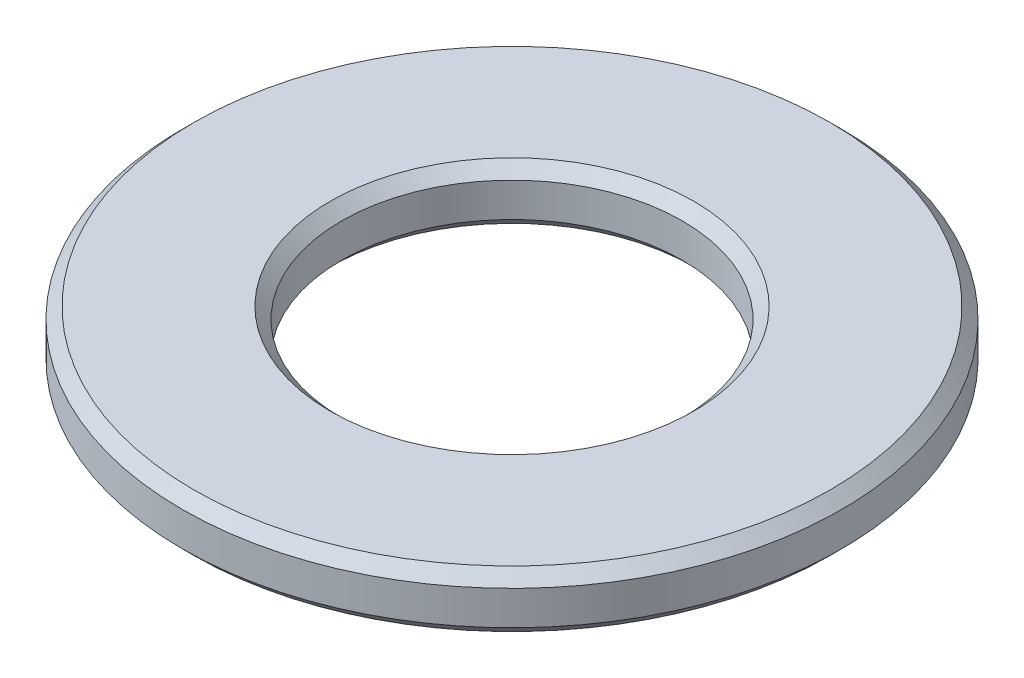
ISO-10303-21;
HEADER;
FILE_DESCRIPTION(('STEP AP214'),'2;1');
FILE_NAME('part.step','',(''),(''),'','','');
FILE_SCHEMA(('AUTOMOTIVE_DESIGN { 1 0 10303 214 1 1 1 1 }'));
ENDSEC;
DATA;
#1=APPLICATION_CONTEXT('core data for automotive mechanical design processes');
#2=APPLICATION_PROTOCOL_DEFINITION('international standard','automotive_design',2000,#1);
#3=PRODUCT_CONTEXT('',#1,'mechanical');
#4=PRODUCT('Part','Part','',(#3));
#5=PRODUCT_RELATED_PRODUCT_CATEGORY('part','',(#4));
#6=PRODUCT_DEFINITION_FORMATION('','',#4);
#7=PRODUCT_DEFINITION_CONTEXT('part definition',#1,'design');
#8=PRODUCT_DEFINITION('design','',#6,#7);
#9=PRODUCT_DEFINITION_SHAPE('','',#8);
#10=(LENGTH_UNIT() NAMED_UNIT(*) SI_UNIT(.MILLI.,.METRE.));
#11=(NAMED_UNIT(*) PLANE_ANGLE_UNIT() SI_UNIT($,.RADIAN.));
#12=(NAMED_UNIT(*) SI_UNIT($,.STERADIAN.) SOLID_ANGLE_UNIT());
#13=UNCERTAINTY_MEASURE_WITH_UNIT(LENGTH_MEASURE(1.E-05),#10,'distance_accuracy_value','');
#14=(GEOMETRIC_REPRESENTATION_CONTEXT(3) GLOBAL_UNCERTAINTY_ASSIGNED_CONTEXT((#13)) GLOBAL_UNIT_ASSIGNED_CONTEXT((#10,
#11,#12)) REPRESENTATION_CONTEXT('',''));
#15=CARTESIAN_POINT('',(0.,0.,0.));
#16=DIRECTION('',(0.,0.,1.));
#17=DIRECTION('',(1.,0.,0.));
#18=AXIS2_PLACEMENT_3D('',#15,#16,#17);
#19=CARTESIAN_POINT('',(0.,0.5,0.));
#20=DIRECTION('',(0.,1.,0.));
#21=DIRECTION('',(0.,0.,1.));
#22=AXIS2_PLACEMENT_3D('',#19,#20,#21);
#23=PLANE('',#22);
#24=CARTESIAN_POINT('',(0.,0.5,0.));
#25=DIRECTION('',(0.,1.,0.));
#26=DIRECTION('',(0.,0.,1.));
#27=AXIS2_PLACEMENT_3D('',#24,#25,#26);
#28=CIRCLE('',#27,1.6);
#29=CARTESIAN_POINT('',(0.,0.5,1.6));
#30=VERTEX_POINT('',#29);
#31=EDGE_CURVE('E10',#30,#30,#28,.F.);
#32=ORIENTED_EDGE('',*,*,#31,.T.);
#33=EDGE_LOOP('',(#32));
#34=FACE_BOUND('',#33,.T.);
#35=CARTESIAN_POINT('',(0.,0.5,0.));
#36=DIRECTION('',(0.,1.,0.));
#37=DIRECTION('',(0.,0.,1.));
#38=AXIS2_PLACEMENT_3D('',#35,#36,#37);
#39=CIRCLE('',#38,2.8);
#40=CARTESIAN_POINT('',(0.,0.5,2.8));
#41=VERTEX_POINT('',#40);
#42=EDGE_CURVE('E38',#41,#41,#39,.T.);
#43=ORIENTED_EDGE('',*,*,#42,.T.);
#44=EDGE_LOOP('',(#43));
#45=FACE_BOUND('',#44,.T.);
#46=ADVANCED_FACE('F31',(#34,#45),#23,.T.);
#47=CARTESIAN_POINT('',(0.,0.,0.));
#48=DIRECTION('',(0.,1.,0.));
#49=DIRECTION('',(0.,0.,1.));
#50=AXIS2_PLACEMENT_3D('',#47,#48,#49);
#51=PLANE('',#50);
#52=CARTESIAN_POINT('',(0.,0.,0.));
#53=DIRECTION('',(0.,1.,0.));
#54=DIRECTION('',(0.,0.,1.));
#55=AXIS2_PLACEMENT_3D('',#52,#53,#54);
#56=CIRCLE('',#55,2.8);
#57=CARTESIAN_POINT('',(0.,0.,2.8));
#58=VERTEX_POINT('',#57);
#59=EDGE_CURVE('E51',#58,#58,#56,.F.);
#60=ORIENTED_EDGE('',*,*,#59,.T.);
#61=EDGE_LOOP('',(#60));
#62=FACE_BOUND('',#61,.T.);
#63=CARTESIAN_POINT('',(0.,0.,0.));
#64=DIRECTION('',(0.,1.,0.));
#65=DIRECTION('',(0.,0.,1.));
#66=AXIS2_PLACEMENT_3D('',#63,#64,#65);
#67=CIRCLE('',#66,1.6);
#68=CARTESIAN_POINT('',(0.,0.,1.6));
#69=VERTEX_POINT('',#68);
#70=EDGE_CURVE('E54',#69,#69,#67,.T.);
#71=ORIENTED_EDGE('',*,*,#70,.T.);
#72=EDGE_LOOP('',(#71));
#73=FACE_BOUND('',#72,.T.);
#74=ADVANCED_FACE('F75',(#62,#73),#51,.F.);
#75=CARTESIAN_POINT('',(0.,0.5,0.));
#76=DIRECTION('',(0.,-1.,0.));
#77=DIRECTION('',(0.,0.,-1.));
#78=AXIS2_PLACEMENT_3D('',#75,#76,#77);
#79=CYLINDRICAL_SURFACE('',#78,2.9);
#80=CARTESIAN_POINT('',(0.,0.0999999999999998,0.));
#81=DIRECTION('',(0.,1.,0.));
#82=DIRECTION('',(0.,0.,1.));
#83=AXIS2_PLACEMENT_3D('',#80,#81,#82);
#84=CIRCLE('',#83,2.9);
#85=CARTESIAN_POINT('',(0.,0.0999999999999998,2.9));
#86=VERTEX_POINT('',#85);
#87=EDGE_CURVE('E57',#86,#86,#84,.T.);
#88=ORIENTED_EDGE('',*,*,#87,.T.);
#89=EDGE_LOOP('',(#88));
#90=FACE_BOUND('',#89,.T.);
#91=CARTESIAN_POINT('',(0.,0.400000000000001,0.));
#92=DIRECTION('',(0.,1.,0.));
#93=DIRECTION('',(0.,0.,1.));
#94=AXIS2_PLACEMENT_3D('',#91,#92,#93);
#95=CIRCLE('',#94,2.9);
#96=CARTESIAN_POINT('',(0.,0.400000000000001,2.9));
#97=VERTEX_POINT('',#96);
#98=EDGE_CURVE('E60',#97,#97,#95,.F.);
#99=ORIENTED_EDGE('',*,*,#98,.T.);
#100=EDGE_LOOP('',(#99));
#101=FACE_BOUND('',#100,.T.);
#102=ADVANCED_FACE('F64',(#90,#101),#79,.T.);
#103=CARTESIAN_POINT('',(0.,0.5,0.));
#104=DIRECTION('',(0.,-1.,0.));
#105=DIRECTION('',(0.,0.,-1.));
#106=AXIS2_PLACEMENT_3D('',#103,#104,#105);
#107=CYLINDRICAL_SURFACE('',#106,1.5);
#108=CARTESIAN_POINT('',(0.,0.100000000000001,0.));
#109=DIRECTION('',(0.,1.,0.));
#110=DIRECTION('',(0.,0.,1.));
#111=AXIS2_PLACEMENT_3D('',#108,#109,#110);
#112=CIRCLE('',#111,1.5);
#113=CARTESIAN_POINT('',(0.,0.100000000000001,1.5));
#114=VERTEX_POINT('',#113);
#115=EDGE_CURVE('E42',#114,#114,#112,.F.);
#116=ORIENTED_EDGE('',*,*,#115,.T.);
#117=EDGE_LOOP('',(#116));
#118=FACE_BOUND('',#117,.T.);
#119=CARTESIAN_POINT('',(0.,0.399999999999998,0.));
#120=DIRECTION('',(0.,1.,0.));
#121=DIRECTION('',(0.,0.,1.));
#122=AXIS2_PLACEMENT_3D('',#119,#120,#121);
#123=CIRCLE('',#122,1.5);
#124=CARTESIAN_POINT('',(0.,0.399999999999998,1.5));
#125=VERTEX_POINT('',#124);
#126=EDGE_CURVE('E46',#125,#125,#123,.T.);
#127=ORIENTED_EDGE('',*,*,#126,.T.);
#128=EDGE_LOOP('',(#127));
#129=FACE_BOUND('',#128,.T.);
#130=ADVANCED_FACE('F83',(#118,#129),#107,.F.);
#131=CARTESIAN_POINT('',(0.,0.0999999999999998,0.));
#132=DIRECTION('',(0.,1.,0.));
#133=DIRECTION('',(0.,0.,1.));
#134=AXIS2_PLACEMENT_3D('',#131,#132,#133);
#135=CONICAL_SURFACE('',#134,2.9,0.78539816339745);
#136=CARTESIAN_POINT('',(0.,0.,2.8));
#137=CARTESIAN_POINT('',(0.,0.0010416666666667,2.80104166666667));
#138=CARTESIAN_POINT('',(0.,0.00208333333333334,2.80208333333333));
#139=CARTESIAN_POINT('',(0.,0.00416666666666662,2.80416666666667));
#140=CARTESIAN_POINT('',(0.,0.00520833333333326,2.80520833333333));
#141=CARTESIAN_POINT('',(0.,0.00729166666666662,2.80729166666667));
#142=CARTESIAN_POINT('',(0.,0.00833333333333333,2.80833333333333));
#143=CARTESIAN_POINT('',(0.,0.0104166666666667,2.81041666666667));
#144=CARTESIAN_POINT('',(0.,0.0114583333333333,2.81145833333333));
#145=CARTESIAN_POINT('',(0.,0.0135416666666666,2.81354166666667));
#146=CARTESIAN_POINT('',(0.,0.0145833333333333,2.81458333333333));
#147=CARTESIAN_POINT('',(0.,0.0166666666666666,2.81666666666667));
#148=CARTESIAN_POINT('',(0.,0.0177083333333333,2.81770833333333));
#149=CARTESIAN_POINT('',(0.,0.0197916666666666,2.81979166666667));
#150=CARTESIAN_POINT('',(0.,0.0208333333333332,2.82083333333333));
#151=CARTESIAN_POINT('',(0.,0.0229166666666666,2.82291666666667));
#152=CARTESIAN_POINT('',(0.,0.0239583333333333,2.82395833333333));
#153=CARTESIAN_POINT('',(0.,0.0260416666666667,2.82604166666667));
#154=CARTESIAN_POINT('',(0.,0.0270833333333333,2.82708333333333));
#155=CARTESIAN_POINT('',(0.,0.0291666666666666,2.82916666666667));
#156=CARTESIAN_POINT('',(0.,0.0302083333333333,2.83020833333333));
#157=CARTESIAN_POINT('',(0.,0.0322916666666666,2.83229166666667));
#158=CARTESIAN_POINT('',(0.,0.0333333333333333,2.83333333333333));
#159=CARTESIAN_POINT('',(0.,0.0354166666666666,2.83541666666667));
#160=CARTESIAN_POINT('',(0.,0.0364583333333333,2.83645833333333));
#161=CARTESIAN_POINT('',(0.,0.0385416666666666,2.83854166666667));
#162=CARTESIAN_POINT('',(0.,0.0395833333333332,2.83958333333333));
#163=CARTESIAN_POINT('',(0.,0.0416666666666666,2.84166666666667));
#164=CARTESIAN_POINT('',(0.,0.0427083333333333,2.84270833333333));
#165=CARTESIAN_POINT('',(0.,0.0447916666666666,2.84479166666667));
#166=CARTESIAN_POINT('',(0.,0.0458333333333333,2.84583333333333));
#167=CARTESIAN_POINT('',(0.,0.0479166666666666,2.84791666666667));
#168=CARTESIAN_POINT('',(0.,0.0489583333333332,2.84895833333333));
#169=CARTESIAN_POINT('',(0.,0.0510416666666666,2.85104166666667));
#170=CARTESIAN_POINT('',(0.,0.0520833333333332,2.85208333333333));
#171=CARTESIAN_POINT('',(0.,0.0541666666666666,2.85416666666667));
#172=CARTESIAN_POINT('',(0.,0.0552083333333332,2.85520833333333));
#173=CARTESIAN_POINT('',(0.,0.0572916666666665,2.85729166666667));
#174=CARTESIAN_POINT('',(0.,0.0583333333333332,2.85833333333333));
#175=CARTESIAN_POINT('',(0.,0.0604166666666666,2.86041666666667));
#176=CARTESIAN_POINT('',(0.,0.0614583333333332,2.86145833333333));
#177=CARTESIAN_POINT('',(0.,0.0635416666666665,2.86354166666667));
#178=CARTESIAN_POINT('',(0.,0.0645833333333332,2.86458333333333));
#179=CARTESIAN_POINT('',(0.,0.0666666666666666,2.86666666666667));
#180=CARTESIAN_POINT('',(0.,0.0677083333333332,2.86770833333333));
#181=CARTESIAN_POINT('',(0.,0.0697916666666665,2.86979166666667));
#182=CARTESIAN_POINT('',(0.,0.0708333333333332,2.87083333333333));
#183=CARTESIAN_POINT('',(0.,0.0729166666666665,2.87291666666667));
#184=CARTESIAN_POINT('',(0.,0.0739583333333332,2.87395833333333));
#185=CARTESIAN_POINT('',(0.,0.0760416666666666,2.87604166666667));
#186=CARTESIAN_POINT('',(0.,0.0770833333333332,2.87708333333333));
#187=CARTESIAN_POINT('',(0.,0.0791666666666665,2.87916666666667));
#188=CARTESIAN_POINT('',(0.,0.0802083333333332,2.88020833333333));
#189=CARTESIAN_POINT('',(0.,0.0822916666666665,2.88229166666667));
#190=CARTESIAN_POINT('',(0.,0.0833333333333332,2.88333333333333));
#191=CARTESIAN_POINT('',(0.,0.0854166666666665,2.88541666666667));
#192=CARTESIAN_POINT('',(0.,0.0864583333333332,2.88645833333333));
#193=CARTESIAN_POINT('',(0.,0.0885416666666665,2.88854166666667));
#194=CARTESIAN_POINT('',(0.,0.0895833333333331,2.88958333333333));
#195=CARTESIAN_POINT('',(0.,0.0916666666666665,2.89166666666667));
#196=CARTESIAN_POINT('',(0.,0.0927083333333332,2.89270833333333));
#197=CARTESIAN_POINT('',(0.,0.0947916666666665,2.89479166666667));
#198=CARTESIAN_POINT('',(0.,0.0958333333333332,2.89583333333333));
#199=CARTESIAN_POINT('',(0.,0.0979166666666665,2.89791666666667));
#200=CARTESIAN_POINT('',(0.,0.0989583333333331,2.89895833333333));
#201=CARTESIAN_POINT('',(0.,0.0999999999999998,2.9));
#202=B_SPLINE_CURVE_WITH_KNOTS('',3,(#136,#137,#138,#139,#140,#141,#142,#143,#144,#145,#146,
#147,#148,#149,#150,#151,#152,#153,#154,#155,#156,#157,#158,#159,#160,#161,#162,#163,#164,#165,
#166,#167,#168,#169,#170,#171,#172,#173,#174,#175,#176,#177,#178,#179,#180,#181,#182,#183,#184,
#185,#186,#187,#188,#189,#190,#191,#192,#193,#194,#195,#196,#197,#198,#199,#200,#201),
.UNSPECIFIED.,.F.,.F.,(4,2,2,2,2,2,2,2,2,2,2,2,2,2,2,2,2,2,2,2,2,2,2,2,2,2,2,2,2,2,2,2,4),(0.,
0.00441941738241598,0.00883883476483196,0.0132582521472476,0.0176776695296636,
0.0220970869120796,0.0265165042944956,0.0309359216769116,0.0353553390593272,0.0397747564417432,
0.0441941738241592,0.0486135912065752,0.0530330085889912,0.0574524259714071,0.0618718433538228,
0.0662912607362388,0.0707106781186548,0.0751300955010708,0.0795495128834867,0.0839689302659024,
0.0883883476483184,0.0928077650307344,0.0972271824131504,0.101646599795566,0.106066017177982,
0.110485434560398,0.114904851942814,0.11932426932523,0.123743686707646,0.128163104090062,
0.132582521472478,0.137001938854894,0.14142135623731),.UNSPECIFIED.);
#203=EDGE_CURVE('BSEAM88',#58,#86,#202,.T.);
#204=ORIENTED_EDGE('',*,*,#59,.F.);
#205=ORIENTED_EDGE('',*,*,#87,.F.);
#206=ORIENTED_EDGE('',*,*,#203,.T.);
#207=ORIENTED_EDGE('',*,*,#203,.F.);
#208=EDGE_LOOP('',(#204,#206,#205,#207));
#209=FACE_BOUND('',#208,.T.);
#210=ADVANCED_FACE('F88',(#209),#135,.T.);
#211=CARTESIAN_POINT('',(0.,0.,0.));
#212=DIRECTION('',(0.,-1.,0.));
#213=DIRECTION('',(0.,0.,-1.));
#214=AXIS2_PLACEMENT_3D('',#211,#212,#213);
#215=CONICAL_SURFACE('',#214,1.6,0.785398163397446);
#216=ORIENTED_EDGE('',*,*,#115,.F.);
#217=EDGE_LOOP('',(#216));
#218=FACE_BOUND('',#217,.T.);
#219=ORIENTED_EDGE('',*,*,#70,.F.);
#220=EDGE_LOOP('',(#219));
#221=FACE_BOUND('',#220,.T.);
#222=ADVANCED_FACE('F72',(#218,#221),#215,.F.);
#223=CARTESIAN_POINT('',(0.,0.399999999999998,0.));
#224=DIRECTION('',(0.,1.,0.));
#225=DIRECTION('',(0.,0.,1.));
#226=AXIS2_PLACEMENT_3D('',#223,#224,#225);
#227=CONICAL_SURFACE('',#226,1.5,0.785398163397449);
#228=ORIENTED_EDGE('',*,*,#31,.F.);
#229=EDGE_LOOP('',(#228));
#230=FACE_BOUND('',#229,.T.);
#231=ORIENTED_EDGE('',*,*,#126,.F.);
#232=EDGE_LOOP('',(#231));
#233=FACE_BOUND('',#232,.T.);
#234=ADVANCED_FACE('F68',(#230,#233),#227,.F.);
#235=CARTESIAN_POINT('',(0.,0.5,0.));
#236=DIRECTION('',(0.,-1.,0.));
#237=DIRECTION('',(0.,0.,-1.));
#238=AXIS2_PLACEMENT_3D('',#235,#236,#237);
#239=CONICAL_SURFACE('',#238,2.8,0.78539816339745);
#240=ORIENTED_EDGE('',*,*,#98,.F.);
#241=EDGE_LOOP('',(#240));
#242=FACE_BOUND('',#241,.T.);
#243=ORIENTED_EDGE('',*,*,#42,.F.);
#244=EDGE_LOOP('',(#243));
#245=FACE_BOUND('',#244,.T.);
#246=ADVANCED_FACE('F33',(#242,#245),#239,.T.);
#247=CLOSED_SHELL('',(#46,#74,#102,#130,#210,#222,#234,#246));
#248=MANIFOLD_SOLID_BREP('B2',#247);
#249=ADVANCED_BREP_SHAPE_REPRESENTATION('',(#18,#248),#14);
#250=SHAPE_DEFINITION_REPRESENTATION(#9,#249);
ENDSEC;
END-ISO-10303-21;
